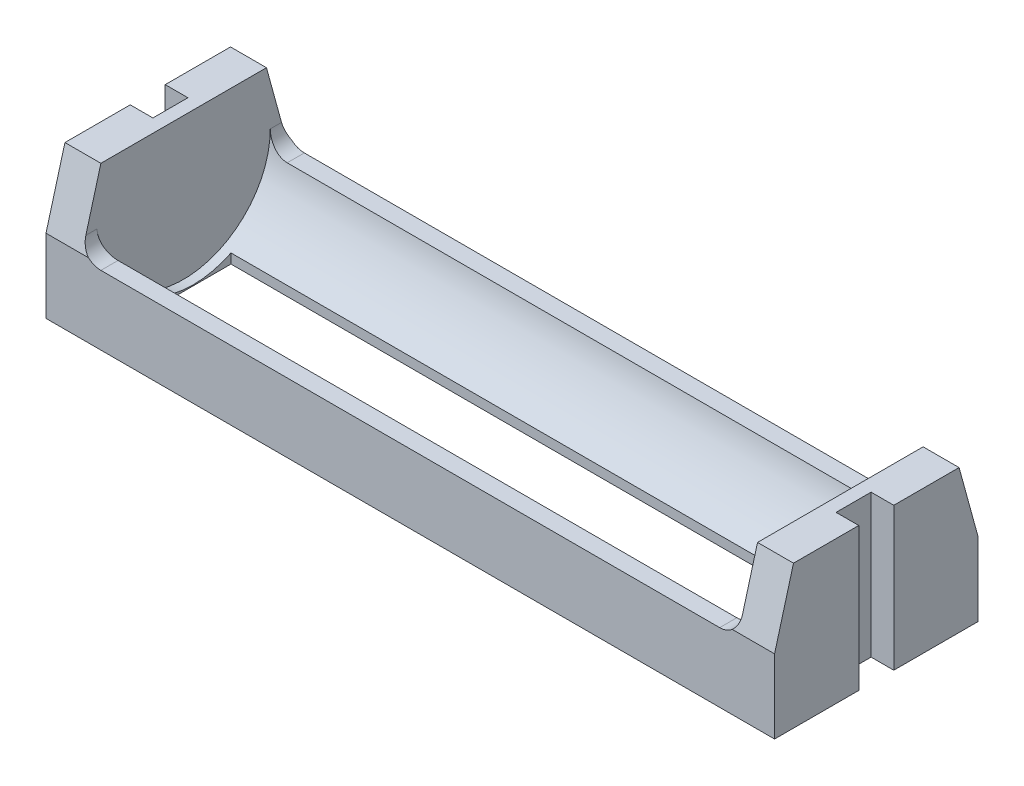
ISO-10303-21;
HEADER;
FILE_DESCRIPTION(('STEP AP214'),'2;1');
FILE_NAME('part.step','',(''),(''),'','','');
FILE_SCHEMA(('AUTOMOTIVE_DESIGN { 1 0 10303 214 1 1 1 1 }'));
ENDSEC;
DATA;
#1=APPLICATION_CONTEXT('core data for automotive mechanical design processes');
#2=APPLICATION_PROTOCOL_DEFINITION('international standard','automotive_design',2000,#1);
#3=PRODUCT_CONTEXT('',#1,'mechanical');
#4=PRODUCT('Part','Part','',(#3));
#5=PRODUCT_RELATED_PRODUCT_CATEGORY('part','',(#4));
#6=PRODUCT_DEFINITION_FORMATION('','',#4);
#7=PRODUCT_DEFINITION_CONTEXT('part definition',#1,'design');
#8=PRODUCT_DEFINITION('design','',#6,#7);
#9=PRODUCT_DEFINITION_SHAPE('','',#8);
#10=(LENGTH_UNIT() NAMED_UNIT(*) SI_UNIT(.MILLI.,.METRE.));
#11=(NAMED_UNIT(*) PLANE_ANGLE_UNIT() SI_UNIT($,.RADIAN.));
#12=(NAMED_UNIT(*) SI_UNIT($,.STERADIAN.) SOLID_ANGLE_UNIT());
#13=UNCERTAINTY_MEASURE_WITH_UNIT(LENGTH_MEASURE(1.E-05),#10,'distance_accuracy_value','');
#14=(GEOMETRIC_REPRESENTATION_CONTEXT(3) GLOBAL_UNCERTAINTY_ASSIGNED_CONTEXT((#13)) GLOBAL_UNIT_ASSIGNED_CONTEXT((#10,
#11,#12)) REPRESENTATION_CONTEXT('',''));
#15=CARTESIAN_POINT('',(0.,0.,0.));
#16=DIRECTION('',(0.,0.,1.));
#17=DIRECTION('',(1.,0.,0.));
#18=AXIS2_PLACEMENT_3D('',#15,#16,#17);
#19=CARTESIAN_POINT('',(38.5,15.1,-10.75));
#20=DIRECTION('',(-1.,0.,0.));
#21=DIRECTION('',(0.,0.,1.));
#22=AXIS2_PLACEMENT_3D('',#19,#20,#21);
#23=PLANE('',#22);
#24=DIRECTION('',(0.,0.,-1.));
#25=VECTOR('',#24,1.);
#26=CARTESIAN_POINT('',(38.5,15.1,-10.75));
#27=LINE('',#26,#25);
#28=CARTESIAN_POINT('',(38.5,15.1,-1.85));
#29=VERTEX_POINT('',#28);
#30=CARTESIAN_POINT('',(38.5,15.1,-8.75));
#31=VERTEX_POINT('',#30);
#32=EDGE_CURVE('E276',#29,#31,#27,.T.);
#33=ORIENTED_EDGE('',*,*,#32,.F.);
#34=DIRECTION('',(0.,-1.,0.));
#35=VECTOR('',#34,1.);
#36=CARTESIAN_POINT('',(38.5,15.1,-1.85));
#37=LINE('',#36,#35);
#38=CARTESIAN_POINT('',(38.5,0.,-1.85));
#39=VERTEX_POINT('',#38);
#40=EDGE_CURVE('E428',#29,#39,#37,.T.);
#41=ORIENTED_EDGE('',*,*,#40,.T.);
#42=DIRECTION('',(0.,0.,-1.));
#43=VECTOR('',#42,1.);
#44=CARTESIAN_POINT('',(38.5,0.,-10.75));
#45=LINE('',#44,#43);
#46=CARTESIAN_POINT('',(38.5,0.,-10.75));
#47=VERTEX_POINT('',#46);
#48=EDGE_CURVE('E269',#39,#47,#45,.T.);
#49=ORIENTED_EDGE('',*,*,#48,.T.);
#50=DIRECTION('',(0.,-1.,0.));
#51=VECTOR('',#50,1.);
#52=CARTESIAN_POINT('',(38.5,15.1,-10.75));
#53=LINE('',#52,#51);
#54=CARTESIAN_POINT('',(38.5,7.79999999999989,-10.75));
#55=VERTEX_POINT('',#54);
#56=EDGE_CURVE('E282',#55,#47,#53,.T.);
#57=ORIENTED_EDGE('',*,*,#56,.F.);
#58=DIRECTION('',(0.,0.964458286836892,0.264235147078597));
#59=VECTOR('',#58,1.);
#60=CARTESIAN_POINT('',(38.5,15.1,-8.75));
#61=LINE('',#60,#59);
#62=EDGE_CURVE('E303',#55,#31,#61,.T.);
#63=ORIENTED_EDGE('',*,*,#62,.T.);
#64=EDGE_LOOP('',(#33,#41,#49,#57,#63));
#65=FACE_BOUND('',#64,.T.);
#66=ADVANCED_FACE('F34',(#65),#23,.F.);
#67=CARTESIAN_POINT('',(-38.5,15.1,-10.75));
#68=DIRECTION('',(1.,0.,0.));
#69=DIRECTION('',(0.,0.,-1.));
#70=AXIS2_PLACEMENT_3D('',#67,#68,#69);
#71=PLANE('',#70);
#72=DIRECTION('',(0.,0.,1.));
#73=VECTOR('',#72,1.);
#74=CARTESIAN_POINT('',(-38.5,15.1,-10.75));
#75=LINE('',#74,#73);
#76=CARTESIAN_POINT('',(-38.5,15.1,1.85));
#77=VERTEX_POINT('',#76);
#78=CARTESIAN_POINT('',(-38.5,15.1,8.74999999999999));
#79=VERTEX_POINT('',#78);
#80=EDGE_CURVE('E257',#77,#79,#75,.T.);
#81=ORIENTED_EDGE('',*,*,#80,.F.);
#82=DIRECTION('',(0.,-1.,0.));
#83=VECTOR('',#82,1.);
#84=CARTESIAN_POINT('',(-38.5,15.1,1.85));
#85=LINE('',#84,#83);
#86=CARTESIAN_POINT('',(-38.5,0.,1.85));
#87=VERTEX_POINT('',#86);
#88=EDGE_CURVE('E450',#77,#87,#85,.T.);
#89=ORIENTED_EDGE('',*,*,#88,.T.);
#90=DIRECTION('',(0.,0.,1.));
#91=VECTOR('',#90,1.);
#92=CARTESIAN_POINT('',(-38.5,0.,-10.75));
#93=LINE('',#92,#91);
#94=CARTESIAN_POINT('',(-38.5,0.,10.75));
#95=VERTEX_POINT('',#94);
#96=EDGE_CURVE('E272',#87,#95,#93,.T.);
#97=ORIENTED_EDGE('',*,*,#96,.T.);
#98=DIRECTION('',(0.,-1.,0.));
#99=VECTOR('',#98,1.);
#100=CARTESIAN_POINT('',(-38.5,15.1,10.75));
#101=LINE('',#100,#99);
#102=CARTESIAN_POINT('',(-38.5,7.79999999999989,10.75));
#103=VERTEX_POINT('',#102);
#104=EDGE_CURVE('E259',#103,#95,#101,.T.);
#105=ORIENTED_EDGE('',*,*,#104,.F.);
#106=DIRECTION('',(0.,0.964458286836892,-0.264235147078597));
#107=VECTOR('',#106,1.);
#108=CARTESIAN_POINT('',(-38.5,15.1,8.74999999999999));
#109=LINE('',#108,#107);
#110=EDGE_CURVE('E292',#103,#79,#109,.T.);
#111=ORIENTED_EDGE('',*,*,#110,.T.);
#112=EDGE_LOOP('',(#81,#89,#97,#105,#111));
#113=FACE_BOUND('',#112,.T.);
#114=ADVANCED_FACE('F529',(#113),#71,.F.);
#115=CARTESIAN_POINT('',(32.7,9.3,-10.75));
#116=DIRECTION('',(0.,0.,1.));
#117=DIRECTION('',(1.,0.,0.));
#118=AXIS2_PLACEMENT_3D('',#115,#116,#117);
#119=CYLINDRICAL_SURFACE('',#118,2.);
#120=DIRECTION('',(0.,0.,1.));
#121=VECTOR('',#120,1.);
#122=CARTESIAN_POINT('',(34.7,9.30000000000001,-10.75));
#123=LINE('',#122,#121);
#124=CARTESIAN_POINT('',(34.7,9.3,9.1498633869583));
#125=VERTEX_POINT('',#124);
#126=CARTESIAN_POINT('',(34.7,9.30000000000001,10.3390410958904));
#127=VERTEX_POINT('',#126);
#128=EDGE_CURVE('E402',#125,#127,#123,.T.);
#129=ORIENTED_EDGE('',*,*,#128,.F.);
#130=CARTESIAN_POINT('',(34.7,9.30000000000001,9.1498633869583));
#131=CARTESIAN_POINT('',(34.7000003814192,9.24447351823052,9.15016960098853));
#132=CARTESIAN_POINT('',(34.6976861265686,9.18897135466801,9.14996402068129));
#133=CARTESIAN_POINT('',(34.6884571981426,9.07837057124859,9.14855696388072));
#134=CARTESIAN_POINT('',(34.6815431073591,9.02327190116368,9.14735561354516));
#135=CARTESIAN_POINT('',(34.6539906528758,8.85937289718779,9.14230799697108));
#136=CARTESIAN_POINT('',(34.6265417559802,8.75168124970104,9.13701943910432));
#137=CARTESIAN_POINT('',(34.5543270732888,8.54255043222191,9.12321393210724));
#138=CARTESIAN_POINT('',(34.5095593199945,8.44111197413789,9.11469661617799));
#139=CARTESIAN_POINT('',(34.40402039627,8.24714599913014,9.09539923460278));
#140=CARTESIAN_POINT('',(34.3432467251979,8.15461987768914,9.08461881544037));
#141=CARTESIAN_POINT('',(34.2064416296697,7.97972287776142,9.06183173700585));
#142=CARTESIAN_POINT('',(34.1302119656655,7.89750906676207,9.04981025952204));
#143=CARTESIAN_POINT('',(33.9650701144002,7.74691070108715,9.026020608089));
#144=CARTESIAN_POINT('',(33.8761552723472,7.67852904850834,9.01425248775795));
#145=CARTESIAN_POINT('',(33.6869191534949,7.55678511399145,8.9921860058458));
#146=CARTESIAN_POINT('',(33.5864769367483,7.50360730710259,8.98190638708622));
#147=CARTESIAN_POINT('',(33.3778550980797,7.41497105012429,8.96421907211148));
#148=CARTESIAN_POINT('',(33.269681189394,7.37949966772341,8.95680928073823));
#149=CARTESIAN_POINT('',(33.0840983756042,7.33570840127058,8.94753150383424));
#150=CARTESIAN_POINT('',(33.0078943128663,7.32233549726263,8.94464947676646));
#151=CARTESIAN_POINT('',(32.8544728958222,7.30447730036716,8.94077534351244));
#152=CARTESIAN_POINT('',(32.7772564807583,7.299984285381,8.93978159527668));
#153=CARTESIAN_POINT('',(32.7,7.3,8.9397986554508));
#154=B_SPLINE_CURVE_WITH_KNOTS('',3,(#130,#131,#132,#133,#134,#135,#136,#137,#138,#139,#140,
#141,#142,#143,#144,#145,#146,#147,#148,#149,#150,#151,#152,#153),.UNSPECIFIED.,.F.,.F.,(4,2,2,
2,2,2,2,2,2,2,2,4),(0.,0.166477876175081,0.332934663879728,0.664994473462219,0.997092017584948,
1.32924147689143,1.66595641351316,2.00274192249642,2.34345541106594,2.68391968593159,
2.91567808396264,3.14723485221533),.UNSPECIFIED.);
#155=CARTESIAN_POINT('',(32.7,7.3,8.9397986554508));
#156=VERTEX_POINT('',#155);
#157=EDGE_CURVE('E370',#125,#156,#154,.T.);
#158=ORIENTED_EDGE('',*,*,#157,.T.);
#159=DIRECTION('',(0.,0.,1.));
#160=VECTOR('',#159,1.);
#161=CARTESIAN_POINT('',(32.7,7.3,-10.75));
#162=LINE('',#161,#160);
#163=CARTESIAN_POINT('',(32.7,7.3,10.75));
#164=VERTEX_POINT('',#163);
#165=EDGE_CURVE('E406',#156,#164,#162,.T.);
#166=ORIENTED_EDGE('',*,*,#165,.T.);
#167=CARTESIAN_POINT('',(32.7,9.3,10.75));
#168=DIRECTION('',(0.,0.,1.));
#169=DIRECTION('',(1.,0.,0.));
#170=AXIS2_PLACEMENT_3D('',#167,#168,#169);
#171=CIRCLE('',#170,2.);
#172=CARTESIAN_POINT('',(34.0228756555322,7.79999999999989,10.75));
#173=VERTEX_POINT('',#172);
#174=EDGE_CURVE('E381',#164,#173,#171,.T.);
#175=ORIENTED_EDGE('',*,*,#174,.T.);
#176=CARTESIAN_POINT('',(32.7,9.3,10.3390410958904));
#177=DIRECTION('',(0.,0.264235147078597,0.964458286836892));
#178=DIRECTION('',(0.,-0.964458286836892,0.264235147078597));
#179=AXIS2_PLACEMENT_3D('',#176,#177,#178);
#180=ELLIPSE('',#179,2.07370295563466,2.);
#181=EDGE_CURVE('E315',#173,#127,#180,.T.);
#182=ORIENTED_EDGE('',*,*,#181,.T.);
#183=EDGE_LOOP('',(#129,#158,#166,#175,#182));
#184=FACE_BOUND('',#183,.T.);
#185=ADVANCED_FACE('F368',(#184),#119,.F.);
#186=CARTESIAN_POINT('',(-32.7,7.3,-10.75));
#187=DIRECTION('',(0.,-1.,0.));
#188=DIRECTION('',(0.,0.,-1.));
#189=AXIS2_PLACEMENT_3D('',#186,#187,#188);
#190=PLANE('',#189);
#191=DIRECTION('',(0.,0.,1.));
#192=VECTOR('',#191,1.);
#193=CARTESIAN_POINT('',(-32.7,7.3,-10.75));
#194=LINE('',#193,#192);
#195=CARTESIAN_POINT('',(-32.7,7.3,-10.75));
#196=VERTEX_POINT('',#195);
#197=CARTESIAN_POINT('',(-32.7,7.3,-8.9397986554508));
#198=VERTEX_POINT('',#197);
#199=EDGE_CURVE('E407',#196,#198,#194,.T.);
#200=ORIENTED_EDGE('',*,*,#199,.T.);
#201=DIRECTION('',(1.,0.,0.));
#202=VECTOR('',#201,1.);
#203=CARTESIAN_POINT('',(-60.5801081914276,7.3,-8.9397986554508));
#204=LINE('',#203,#202);
#205=CARTESIAN_POINT('',(32.7,7.3,-8.9397986554508));
#206=VERTEX_POINT('',#205);
#207=EDGE_CURVE('E361',#198,#206,#204,.T.);
#208=ORIENTED_EDGE('',*,*,#207,.T.);
#209=CARTESIAN_POINT('',(32.7,7.3,-10.75));
#210=VERTEX_POINT('',#209);
#211=EDGE_CURVE('E403',#210,#206,#162,.T.);
#212=ORIENTED_EDGE('',*,*,#211,.F.);
#213=DIRECTION('',(1.,0.,0.));
#214=VECTOR('',#213,1.);
#215=CARTESIAN_POINT('',(-32.7,7.3,-10.75));
#216=LINE('',#215,#214);
#217=EDGE_CURVE('E380',#196,#210,#216,.T.);
#218=ORIENTED_EDGE('',*,*,#217,.F.);
#219=EDGE_LOOP('',(#200,#208,#212,#218));
#220=FACE_BOUND('',#219,.T.);
#221=ADVANCED_FACE('F502',(#220),#190,.F.);
#222=CARTESIAN_POINT('',(-32.7,9.3,-10.75));
#223=DIRECTION('',(0.,0.,1.));
#224=DIRECTION('',(1.,0.,0.));
#225=AXIS2_PLACEMENT_3D('',#222,#223,#224);
#226=CYLINDRICAL_SURFACE('',#225,2.);
#227=CARTESIAN_POINT('',(-32.7,7.3,8.9397986554508));
#228=VERTEX_POINT('',#227);
#229=CARTESIAN_POINT('',(-32.7,7.3,10.75));
#230=VERTEX_POINT('',#229);
#231=EDGE_CURVE('E410',#228,#230,#194,.T.);
#232=ORIENTED_EDGE('',*,*,#231,.F.);
#233=CARTESIAN_POINT('',(-32.7,7.3,8.9397986554508));
#234=CARTESIAN_POINT('',(-32.7555927508141,7.29999961020679,8.93979549930712));
#235=CARTESIAN_POINT('',(-32.8111582140747,7.30231938618891,8.94030490376732));
#236=CARTESIAN_POINT('',(-32.9218785323546,7.31156890879201,8.94231615197878));
#237=CARTESIAN_POINT('',(-32.9770334419478,7.31849803122341,8.94381786135367));
#238=CARTESIAN_POINT('',(-33.1410880254544,7.34610720259547,8.9497524117272));
#239=CARTESIAN_POINT('',(-33.2488683556103,7.37360942513651,8.95561500839226));
#240=CARTESIAN_POINT('',(-33.4581482770812,7.44595309688481,8.97046599019638));
#241=CARTESIAN_POINT('',(-33.559647398922,7.49079584035754,8.97945460865109));
#242=CARTESIAN_POINT('',(-33.7537229248556,7.59651089056488,8.99951990736819));
#243=CARTESIAN_POINT('',(-33.8462977587527,7.65738601113137,9.01059695407219));
#244=CARTESIAN_POINT('',(-34.0213292454586,7.79446857612004,9.03375978541136));
#245=CARTESIAN_POINT('',(-34.1036222461514,7.87088285795433,9.04585773156088));
#246=CARTESIAN_POINT('',(-34.2543356298042,8.03644463992197,9.06955143579611));
#247=CARTESIAN_POINT('',(-34.3227534791614,8.12559446050856,9.08114710186203));
#248=CARTESIAN_POINT('',(-34.4443857539703,8.31515228640953,9.1026224935208));
#249=CARTESIAN_POINT('',(-34.49744642179,8.41566101979673,9.11248450142029));
#250=CARTESIAN_POINT('',(-34.5858369922622,8.6243956096749,9.12918662394288));
#251=CARTESIAN_POINT('',(-34.6211796923849,8.73261583153579,9.13602891923855));
#252=CARTESIAN_POINT('',(-34.6646602825389,8.91786920163539,9.14427713384794));
#253=CARTESIAN_POINT('',(-34.6778965455126,8.99369860599084,9.14672480156106));
#254=CARTESIAN_POINT('',(-34.6955700464009,9.1463413698306,9.14973465559631));
#255=CARTESIAN_POINT('',(-34.7000153337956,9.22315376429997,9.15029856711127));
#256=CARTESIAN_POINT('',(-34.7,9.3,9.1498633869583));
#257=B_SPLINE_CURVE_WITH_KNOTS('',3,(#233,#234,#235,#236,#237,#238,#239,#240,#241,#242,#243,
#244,#245,#246,#247,#248,#249,#250,#251,#252,#253,#254,#255,#256),.UNSPECIFIED.,.F.,.F.,(4,2,2,
2,2,2,2,2,2,2,2,4),(0.,0.166673718115008,0.333324870162048,0.665766080619783,0.99823210868575,
1.33075652657495,1.66803686410081,2.00537873367856,2.34598969669459,2.6863542848618,
2.91689846852728,3.14723145587301),.UNSPECIFIED.);
#258=CARTESIAN_POINT('',(-34.7,9.3,9.1498633869583));
#259=VERTEX_POINT('',#258);
#260=EDGE_CURVE('E329',#228,#259,#257,.T.);
#261=ORIENTED_EDGE('',*,*,#260,.T.);
#262=DIRECTION('',(0.,0.,1.));
#263=VECTOR('',#262,1.);
#264=CARTESIAN_POINT('',(-34.7,9.3,-10.75));
#265=LINE('',#264,#263);
#266=CARTESIAN_POINT('',(-34.7,9.3,10.3390410958904));
#267=VERTEX_POINT('',#266);
#268=EDGE_CURVE('E387',#259,#267,#265,.T.);
#269=ORIENTED_EDGE('',*,*,#268,.T.);
#270=CARTESIAN_POINT('',(-32.7,9.3,10.3390410958904));
#271=DIRECTION('',(0.,0.264235147078597,0.964458286836892));
#272=DIRECTION('',(0.,-0.964458286836892,0.264235147078597));
#273=AXIS2_PLACEMENT_3D('',#270,#271,#272);
#274=ELLIPSE('',#273,2.07370295563466,2.);
#275=CARTESIAN_POINT('',(-34.0228756555322,7.79999999999989,10.75));
#276=VERTEX_POINT('',#275);
#277=EDGE_CURVE('E310',#267,#276,#274,.T.);
#278=ORIENTED_EDGE('',*,*,#277,.T.);
#279=CARTESIAN_POINT('',(-32.7,9.3,10.75));
#280=DIRECTION('',(0.,0.,1.));
#281=DIRECTION('',(-1.,0.,0.));
#282=AXIS2_PLACEMENT_3D('',#279,#280,#281);
#283=CIRCLE('',#282,2.);
#284=EDGE_CURVE('E376',#276,#230,#283,.T.);
#285=ORIENTED_EDGE('',*,*,#284,.T.);
#286=EDGE_LOOP('',(#232,#261,#269,#278,#285));
#287=FACE_BOUND('',#286,.T.);
#288=ADVANCED_FACE('F740',(#287),#226,.F.);
#289=CARTESIAN_POINT('',(0.,15.1,0.));
#290=DIRECTION('',(0.,1.,0.));
#291=DIRECTION('',(0.,0.,1.));
#292=AXIS2_PLACEMENT_3D('',#289,#290,#291);
#293=PLANE('',#292);
#294=DIRECTION('',(-1.,0.,0.));
#295=VECTOR('',#294,1.);
#296=CARTESIAN_POINT('',(-38.5,15.1,1.85));
#297=LINE('',#296,#295);
#298=CARTESIAN_POINT('',(-36.1,15.1,1.85));
#299=VERTEX_POINT('',#298);
#300=EDGE_CURVE('E248',#299,#77,#297,.T.);
#301=ORIENTED_EDGE('',*,*,#300,.T.);
#302=ORIENTED_EDGE('',*,*,#80,.T.);
#303=DIRECTION('',(1.,0.,0.));
#304=VECTOR('',#303,1.);
#305=CARTESIAN_POINT('',(38.5,15.1,8.74999999999999));
#306=LINE('',#305,#304);
#307=CARTESIAN_POINT('',(-34.7,15.1,8.74999999999999));
#308=VERTEX_POINT('',#307);
#309=EDGE_CURVE('E286',#79,#308,#306,.T.);
#310=ORIENTED_EDGE('',*,*,#309,.T.);
#311=DIRECTION('',(0.,0.,1.));
#312=VECTOR('',#311,1.);
#313=CARTESIAN_POINT('',(-34.7,15.1,-10.75));
#314=LINE('',#313,#312);
#315=CARTESIAN_POINT('',(-34.7,15.1,-8.75));
#316=VERTEX_POINT('',#315);
#317=EDGE_CURVE('E394',#316,#308,#314,.T.);
#318=ORIENTED_EDGE('',*,*,#317,.F.);
#319=DIRECTION('',(-1.,0.,0.));
#320=VECTOR('',#319,1.);
#321=CARTESIAN_POINT('',(-38.5,15.1,-8.75));
#322=LINE('',#321,#320);
#323=CARTESIAN_POINT('',(-38.5,15.1,-8.75));
#324=VERTEX_POINT('',#323);
#325=EDGE_CURVE('E254',#316,#324,#322,.T.);
#326=ORIENTED_EDGE('',*,*,#325,.T.);
#327=CARTESIAN_POINT('',(-38.5,15.1,-1.85));
#328=VERTEX_POINT('',#327);
#329=EDGE_CURVE('E245',#324,#328,#75,.T.);
#330=ORIENTED_EDGE('',*,*,#329,.T.);
#331=DIRECTION('',(1.,0.,0.));
#332=VECTOR('',#331,1.);
#333=CARTESIAN_POINT('',(-38.5,15.1,-1.85));
#334=LINE('',#333,#332);
#335=CARTESIAN_POINT('',(-36.1,15.1,-1.85));
#336=VERTEX_POINT('',#335);
#337=EDGE_CURVE('E231',#328,#336,#334,.T.);
#338=ORIENTED_EDGE('',*,*,#337,.T.);
#339=DIRECTION('',(0.,0.,1.));
#340=VECTOR('',#339,1.);
#341=CARTESIAN_POINT('',(-36.1,15.1,1.85));
#342=LINE('',#341,#340);
#343=EDGE_CURVE('E238',#336,#299,#342,.T.);
#344=ORIENTED_EDGE('',*,*,#343,.T.);
#345=EDGE_LOOP('',(#301,#302,#310,#318,#326,#330,#338,#344));
#346=FACE_BOUND('',#345,.T.);
#347=ADVANCED_FACE('F251',(#346),#293,.T.);
#348=CARTESIAN_POINT('',(0.,15.1,-8.75));
#349=DIRECTION('',(0.,0.264235147078597,-0.964458286836892));
#350=DIRECTION('',(1.,0.,0.));
#351=AXIS2_PLACEMENT_3D('',#348,#349,#350);
#352=PLANE('',#351);
#353=DIRECTION('',(0.,-0.964458286836892,-0.264235147078597));
#354=VECTOR('',#353,1.);
#355=CARTESIAN_POINT('',(34.7,15.1,-8.75));
#356=LINE('',#355,#354);
#357=CARTESIAN_POINT('',(34.7,15.1,-8.75));
#358=VERTEX_POINT('',#357);
#359=CARTESIAN_POINT('',(34.7,9.30000000000001,-10.3390410958904));
#360=VERTEX_POINT('',#359);
#361=EDGE_CURVE('E417',#358,#360,#356,.T.);
#362=ORIENTED_EDGE('',*,*,#361,.F.);
#363=EDGE_CURVE('E289',#31,#358,#322,.T.);
#364=ORIENTED_EDGE('',*,*,#363,.F.);
#365=ORIENTED_EDGE('',*,*,#62,.F.);
#366=DIRECTION('',(1.,0.,0.));
#367=VECTOR('',#366,1.);
#368=CARTESIAN_POINT('',(38.5,7.79999999999989,-10.75));
#369=LINE('',#368,#367);
#370=CARTESIAN_POINT('',(34.0228756555322,7.79999999999989,-10.75));
#371=VERTEX_POINT('',#370);
#372=EDGE_CURVE('E297',#371,#55,#369,.T.);
#373=ORIENTED_EDGE('',*,*,#372,.F.);
#374=CARTESIAN_POINT('',(32.7,9.3,-10.3390410958904));
#375=DIRECTION('',(0.,0.264235147078597,-0.964458286836892));
#376=DIRECTION('',(0.,0.964458286836892,0.264235147078597));
#377=AXIS2_PLACEMENT_3D('',#374,#375,#376);
#378=ELLIPSE('',#377,2.07370295563466,2.);
#379=EDGE_CURVE('E415',#360,#371,#378,.T.);
#380=ORIENTED_EDGE('',*,*,#379,.F.);
#381=EDGE_LOOP('',(#362,#364,#365,#373,#380));
#382=FACE_BOUND('',#381,.T.);
#383=ADVANCED_FACE('F514',(#382),#352,.T.);
#384=CARTESIAN_POINT('',(0.,15.1,8.74999999999999));
#385=DIRECTION('',(0.,0.264235147078597,0.964458286836892));
#386=DIRECTION('',(-1.,0.,0.));
#387=AXIS2_PLACEMENT_3D('',#384,#385,#386);
#388=PLANE('',#387);
#389=DIRECTION('',(0.,0.964458286836892,-0.264235147078597));
#390=VECTOR('',#389,1.);
#391=CARTESIAN_POINT('',(34.7,15.1,8.74999999999999));
#392=LINE('',#391,#390);
#393=CARTESIAN_POINT('',(34.7,15.1,8.74999999999999));
#394=VERTEX_POINT('',#393);
#395=EDGE_CURVE('E318',#127,#394,#392,.T.);
#396=ORIENTED_EDGE('',*,*,#395,.F.);
#397=ORIENTED_EDGE('',*,*,#181,.F.);
#398=DIRECTION('',(-1.,0.,0.));
#399=VECTOR('',#398,1.);
#400=CARTESIAN_POINT('',(-38.5,7.79999999999989,10.75));
#401=LINE('',#400,#399);
#402=CARTESIAN_POINT('',(38.5,7.79999999999989,10.75));
#403=VERTEX_POINT('',#402);
#404=EDGE_CURVE('E307',#403,#173,#401,.T.);
#405=ORIENTED_EDGE('',*,*,#404,.F.);
#406=DIRECTION('',(0.,-0.964458286836892,0.264235147078597));
#407=VECTOR('',#406,1.);
#408=CARTESIAN_POINT('',(38.5,15.1,8.74999999999999));
#409=LINE('',#408,#407);
#410=CARTESIAN_POINT('',(38.5,15.1,8.74999999999999));
#411=VERTEX_POINT('',#410);
#412=EDGE_CURVE('E301',#411,#403,#409,.T.);
#413=ORIENTED_EDGE('',*,*,#412,.F.);
#414=EDGE_CURVE('E285',#394,#411,#306,.T.);
#415=ORIENTED_EDGE('',*,*,#414,.F.);
#416=EDGE_LOOP('',(#396,#397,#405,#413,#415));
#417=FACE_BOUND('',#416,.T.);
#418=ADVANCED_FACE('F521',(#417),#388,.T.);
#419=CARTESIAN_POINT('',(38.5,0.,10.75));
#420=VERTEX_POINT('',#419);
#421=CARTESIAN_POINT('',(38.5,0.,1.85));
#422=VERTEX_POINT('',#421);
#423=EDGE_CURVE('E265',#420,#422,#45,.T.);
#424=ORIENTED_EDGE('',*,*,#423,.T.);
#425=DIRECTION('',(0.,-1.,0.));
#426=VECTOR('',#425,1.);
#427=CARTESIAN_POINT('',(38.5,15.1,1.85));
#428=LINE('',#427,#426);
#429=CARTESIAN_POINT('',(38.5,15.1,1.85));
#430=VERTEX_POINT('',#429);
#431=EDGE_CURVE('E466',#430,#422,#428,.T.);
#432=ORIENTED_EDGE('',*,*,#431,.F.);
#433=EDGE_CURVE('E261',#411,#430,#27,.T.);
#434=ORIENTED_EDGE('',*,*,#433,.F.);
#435=ORIENTED_EDGE('',*,*,#412,.T.);
#436=DIRECTION('',(0.,-1.,0.));
#437=VECTOR('',#436,1.);
#438=CARTESIAN_POINT('',(38.5,15.1,10.75));
#439=LINE('',#438,#437);
#440=EDGE_CURVE('E256',#403,#420,#439,.T.);
#441=ORIENTED_EDGE('',*,*,#440,.T.);
#442=EDGE_LOOP('',(#424,#432,#434,#435,#441));
#443=FACE_BOUND('',#442,.T.);
#444=ADVANCED_FACE('F530',(#443),#23,.F.);
#445=CARTESIAN_POINT('',(-38.5,15.1,-10.75));
#446=DIRECTION('',(0.,0.,1.));
#447=DIRECTION('',(1.,0.,0.));
#448=AXIS2_PLACEMENT_3D('',#445,#446,#447);
#449=PLANE('',#448);
#450=ORIENTED_EDGE('',*,*,#217,.T.);
#451=CARTESIAN_POINT('',(32.7,9.3,-10.75));
#452=DIRECTION('',(0.,0.,1.));
#453=DIRECTION('',(1.,0.,0.));
#454=AXIS2_PLACEMENT_3D('',#451,#452,#453);
#455=CIRCLE('',#454,2.);
#456=EDGE_CURVE('E384',#210,#371,#455,.T.);
#457=ORIENTED_EDGE('',*,*,#456,.T.);
#458=ORIENTED_EDGE('',*,*,#372,.T.);
#459=ORIENTED_EDGE('',*,*,#56,.T.);
#460=DIRECTION('',(-1.,0.,0.));
#461=VECTOR('',#460,1.);
#462=CARTESIAN_POINT('',(-38.5,0.,-10.75));
#463=LINE('',#462,#461);
#464=CARTESIAN_POINT('',(-38.5,0.,-10.75));
#465=VERTEX_POINT('',#464);
#466=EDGE_CURVE('E268',#47,#465,#463,.T.);
#467=ORIENTED_EDGE('',*,*,#466,.T.);
#468=DIRECTION('',(0.,-1.,0.));
#469=VECTOR('',#468,1.);
#470=CARTESIAN_POINT('',(-38.5,15.1,-10.75));
#471=LINE('',#470,#469);
#472=CARTESIAN_POINT('',(-38.5,7.79999999999989,-10.75));
#473=VERTEX_POINT('',#472);
#474=EDGE_CURVE('E280',#473,#465,#471,.T.);
#475=ORIENTED_EDGE('',*,*,#474,.F.);
#476=CARTESIAN_POINT('',(-34.0228756555322,7.79999999999989,-10.75));
#477=VERTEX_POINT('',#476);
#478=EDGE_CURVE('E298',#473,#477,#369,.T.);
#479=ORIENTED_EDGE('',*,*,#478,.T.);
#480=CARTESIAN_POINT('',(-32.7,9.3,-10.75));
#481=DIRECTION('',(0.,0.,1.));
#482=DIRECTION('',(-1.,0.,0.));
#483=AXIS2_PLACEMENT_3D('',#480,#481,#482);
#484=CIRCLE('',#483,2.);
#485=EDGE_CURVE('E377',#477,#196,#484,.T.);
#486=ORIENTED_EDGE('',*,*,#485,.T.);
#487=EDGE_LOOP('',(#450,#457,#458,#459,#467,#475,#479,#486));
#488=FACE_BOUND('',#487,.T.);
#489=ADVANCED_FACE('F433',(#488),#449,.F.);
#490=CARTESIAN_POINT('',(-38.5,0.,-1.85));
#491=VERTEX_POINT('',#490);
#492=EDGE_CURVE('E247',#465,#491,#93,.T.);
#493=ORIENTED_EDGE('',*,*,#492,.T.);
#494=DIRECTION('',(0.,-1.,0.));
#495=VECTOR('',#494,1.);
#496=CARTESIAN_POINT('',(-38.5,15.1,-1.85));
#497=LINE('',#496,#495);
#498=EDGE_CURVE('E57',#328,#491,#497,.T.);
#499=ORIENTED_EDGE('',*,*,#498,.F.);
#500=ORIENTED_EDGE('',*,*,#329,.F.);
#501=DIRECTION('',(0.,-0.964458286836892,-0.264235147078597));
#502=VECTOR('',#501,1.);
#503=CARTESIAN_POINT('',(-38.5,15.1,-8.75));
#504=LINE('',#503,#502);
#505=EDGE_CURVE('E295',#324,#473,#504,.T.);
#506=ORIENTED_EDGE('',*,*,#505,.T.);
#507=ORIENTED_EDGE('',*,*,#474,.T.);
#508=EDGE_LOOP('',(#493,#499,#500,#506,#507));
#509=FACE_BOUND('',#508,.T.);
#510=ADVANCED_FACE('F244',(#509),#71,.F.);
#511=CARTESIAN_POINT('',(-38.5,15.1,10.75));
#512=DIRECTION('',(0.,0.,-1.));
#513=DIRECTION('',(-1.,0.,0.));
#514=AXIS2_PLACEMENT_3D('',#511,#512,#513);
#515=PLANE('',#514);
#516=ORIENTED_EDGE('',*,*,#404,.T.);
#517=ORIENTED_EDGE('',*,*,#174,.F.);
#518=DIRECTION('',(1.,0.,0.));
#519=VECTOR('',#518,1.);
#520=CARTESIAN_POINT('',(-32.7,7.3,10.75));
#521=LINE('',#520,#519);
#522=EDGE_CURVE('E390',#230,#164,#521,.T.);
#523=ORIENTED_EDGE('',*,*,#522,.F.);
#524=ORIENTED_EDGE('',*,*,#284,.F.);
#525=EDGE_CURVE('E306',#276,#103,#401,.T.);
#526=ORIENTED_EDGE('',*,*,#525,.T.);
#527=ORIENTED_EDGE('',*,*,#104,.T.);
#528=DIRECTION('',(1.,0.,0.));
#529=VECTOR('',#528,1.);
#530=CARTESIAN_POINT('',(-38.5,0.,10.75));
#531=LINE('',#530,#529);
#532=EDGE_CURVE('E274',#95,#420,#531,.T.);
#533=ORIENTED_EDGE('',*,*,#532,.T.);
#534=ORIENTED_EDGE('',*,*,#440,.F.);
#535=EDGE_LOOP('',(#516,#517,#523,#524,#526,#527,#533,#534));
#536=FACE_BOUND('',#535,.T.);
#537=ADVANCED_FACE('F569',(#536),#515,.F.);
#538=DIRECTION('',(1.,0.,0.));
#539=VECTOR('',#538,1.);
#540=CARTESIAN_POINT('',(38.5,15.1,-1.85));
#541=LINE('',#540,#539);
#542=CARTESIAN_POINT('',(36.1,15.1,-1.85));
#543=VERTEX_POINT('',#542);
#544=EDGE_CURVE('E463',#543,#29,#541,.T.);
#545=ORIENTED_EDGE('',*,*,#544,.T.);
#546=ORIENTED_EDGE('',*,*,#32,.T.);
#547=ORIENTED_EDGE('',*,*,#363,.T.);
#548=DIRECTION('',(0.,0.,1.));
#549=VECTOR('',#548,1.);
#550=CARTESIAN_POINT('',(34.7,15.1,-10.75));
#551=LINE('',#550,#549);
#552=EDGE_CURVE('E397',#358,#394,#551,.T.);
#553=ORIENTED_EDGE('',*,*,#552,.T.);
#554=ORIENTED_EDGE('',*,*,#414,.T.);
#555=ORIENTED_EDGE('',*,*,#433,.T.);
#556=DIRECTION('',(-1.,0.,0.));
#557=VECTOR('',#556,1.);
#558=CARTESIAN_POINT('',(38.5,15.1,1.85));
#559=LINE('',#558,#557);
#560=CARTESIAN_POINT('',(36.1,15.1,1.85));
#561=VERTEX_POINT('',#560);
#562=EDGE_CURVE('E456',#430,#561,#559,.T.);
#563=ORIENTED_EDGE('',*,*,#562,.T.);
#564=DIRECTION('',(0.,0.,-1.));
#565=VECTOR('',#564,1.);
#566=CARTESIAN_POINT('',(36.1,15.1,1.85));
#567=LINE('',#566,#565);
#568=EDGE_CURVE('E459',#561,#543,#567,.T.);
#569=ORIENTED_EDGE('',*,*,#568,.T.);
#570=EDGE_LOOP('',(#545,#546,#547,#553,#554,#555,#563,#569));
#571=FACE_BOUND('',#570,.T.);
#572=ADVANCED_FACE('F522',(#571),#293,.T.);
#573=CARTESIAN_POINT('',(0.,0.,0.));
#574=DIRECTION('',(0.,1.,0.));
#575=DIRECTION('',(0.,0.,1.));
#576=AXIS2_PLACEMENT_3D('',#573,#574,#575);
#577=PLANE('',#576);
#578=DIRECTION('',(-1.,0.,0.));
#579=VECTOR('',#578,1.);
#580=CARTESIAN_POINT('',(-33.7,0.,4.));
#581=LINE('',#580,#579);
#582=CARTESIAN_POINT('',(33.7,0.,4.));
#583=VERTEX_POINT('',#582);
#584=CARTESIAN_POINT('',(-33.7,0.,4.));
#585=VERTEX_POINT('',#584);
#586=EDGE_CURVE('E479',#583,#585,#581,.T.);
#587=ORIENTED_EDGE('',*,*,#586,.F.);
#588=DIRECTION('',(0.,0.,1.));
#589=VECTOR('',#588,1.);
#590=CARTESIAN_POINT('',(33.7,0.,4.));
#591=LINE('',#590,#589);
#592=CARTESIAN_POINT('',(33.7,0.,-4.));
#593=VERTEX_POINT('',#592);
#594=EDGE_CURVE('E49',#593,#583,#591,.T.);
#595=ORIENTED_EDGE('',*,*,#594,.F.);
#596=DIRECTION('',(1.,0.,0.));
#597=VECTOR('',#596,1.);
#598=CARTESIAN_POINT('',(-33.7,0.,-4.));
#599=LINE('',#598,#597);
#600=CARTESIAN_POINT('',(-33.7,0.,-4.));
#601=VERTEX_POINT('',#600);
#602=EDGE_CURVE('E485',#601,#593,#599,.T.);
#603=ORIENTED_EDGE('',*,*,#602,.F.);
#604=DIRECTION('',(0.,0.,-1.));
#605=VECTOR('',#604,1.);
#606=CARTESIAN_POINT('',(-33.7,0.,4.));
#607=LINE('',#606,#605);
#608=EDGE_CURVE('E482',#585,#601,#607,.T.);
#609=ORIENTED_EDGE('',*,*,#608,.F.);
#610=EDGE_LOOP('',(#587,#595,#603,#609));
#611=FACE_BOUND('',#610,.T.);
#612=ORIENTED_EDGE('',*,*,#48,.F.);
#613=DIRECTION('',(1.,0.,0.));
#614=VECTOR('',#613,1.);
#615=CARTESIAN_POINT('',(38.5,0.,-1.85));
#616=LINE('',#615,#614);
#617=CARTESIAN_POINT('',(36.1,0.,-1.85));
#618=VERTEX_POINT('',#617);
#619=EDGE_CURVE('E460',#618,#39,#616,.T.);
#620=ORIENTED_EDGE('',*,*,#619,.F.);
#621=DIRECTION('',(0.,0.,-1.));
#622=VECTOR('',#621,1.);
#623=CARTESIAN_POINT('',(36.1,0.,1.85));
#624=LINE('',#623,#622);
#625=CARTESIAN_POINT('',(36.1,0.,1.85));
#626=VERTEX_POINT('',#625);
#627=EDGE_CURVE('E470',#626,#618,#624,.T.);
#628=ORIENTED_EDGE('',*,*,#627,.F.);
#629=DIRECTION('',(-1.,0.,0.));
#630=VECTOR('',#629,1.);
#631=CARTESIAN_POINT('',(38.5,0.,1.85));
#632=LINE('',#631,#630);
#633=EDGE_CURVE('E467',#422,#626,#632,.T.);
#634=ORIENTED_EDGE('',*,*,#633,.F.);
#635=ORIENTED_EDGE('',*,*,#423,.F.);
#636=ORIENTED_EDGE('',*,*,#532,.F.);
#637=ORIENTED_EDGE('',*,*,#96,.F.);
#638=DIRECTION('',(-1.,0.,0.));
#639=VECTOR('',#638,1.);
#640=CARTESIAN_POINT('',(-38.5,0.,1.85));
#641=LINE('',#640,#639);
#642=CARTESIAN_POINT('',(-36.1,0.,1.85));
#643=VERTEX_POINT('',#642);
#644=EDGE_CURVE('E239',#643,#87,#641,.T.);
#645=ORIENTED_EDGE('',*,*,#644,.F.);
#646=DIRECTION('',(0.,0.,1.));
#647=VECTOR('',#646,1.);
#648=CARTESIAN_POINT('',(-36.1,0.,1.85));
#649=LINE('',#648,#647);
#650=CARTESIAN_POINT('',(-36.1,0.,-1.85));
#651=VERTEX_POINT('',#650);
#652=EDGE_CURVE('E441',#651,#643,#649,.T.);
#653=ORIENTED_EDGE('',*,*,#652,.F.);
#654=DIRECTION('',(1.,0.,0.));
#655=VECTOR('',#654,1.);
#656=CARTESIAN_POINT('',(-38.5,0.,-1.85));
#657=LINE('',#656,#655);
#658=EDGE_CURVE('E438',#491,#651,#657,.T.);
#659=ORIENTED_EDGE('',*,*,#658,.F.);
#660=ORIENTED_EDGE('',*,*,#492,.F.);
#661=ORIENTED_EDGE('',*,*,#466,.F.);
#662=EDGE_LOOP('',(#612,#620,#628,#634,#635,#636,#637,#645,#653,#659,#660,#661));
#663=FACE_BOUND('',#662,.T.);
#664=ADVANCED_FACE('F436',(#611,#663),#577,.F.);
#665=DIRECTION('',(0.,0.964458286836892,0.264235147078597));
#666=VECTOR('',#665,1.);
#667=CARTESIAN_POINT('',(-34.7,15.1,-8.75));
#668=LINE('',#667,#666);
#669=CARTESIAN_POINT('',(-34.7,9.3,-10.3390410958904));
#670=VERTEX_POINT('',#669);
#671=EDGE_CURVE('E418',#670,#316,#668,.T.);
#672=ORIENTED_EDGE('',*,*,#671,.F.);
#673=CARTESIAN_POINT('',(-32.7,9.3,-10.3390410958904));
#674=DIRECTION('',(0.,0.264235147078597,-0.964458286836892));
#675=DIRECTION('',(0.,0.964458286836892,0.264235147078597));
#676=AXIS2_PLACEMENT_3D('',#673,#674,#675);
#677=ELLIPSE('',#676,2.07370295563466,2.);
#678=EDGE_CURVE('E396',#477,#670,#677,.T.);
#679=ORIENTED_EDGE('',*,*,#678,.F.);
#680=ORIENTED_EDGE('',*,*,#478,.F.);
#681=ORIENTED_EDGE('',*,*,#505,.F.);
#682=ORIENTED_EDGE('',*,*,#325,.F.);
#683=EDGE_LOOP('',(#672,#679,#680,#681,#682));
#684=FACE_BOUND('',#683,.T.);
#685=ADVANCED_FACE('F512',(#684),#352,.T.);
#686=DIRECTION('',(0.,-0.964458286836892,0.264235147078597));
#687=VECTOR('',#686,1.);
#688=CARTESIAN_POINT('',(-34.7,15.1,8.74999999999999));
#689=LINE('',#688,#687);
#690=EDGE_CURVE('E312',#308,#267,#689,.T.);
#691=ORIENTED_EDGE('',*,*,#690,.F.);
#692=ORIENTED_EDGE('',*,*,#309,.F.);
#693=ORIENTED_EDGE('',*,*,#110,.F.);
#694=ORIENTED_EDGE('',*,*,#525,.F.);
#695=ORIENTED_EDGE('',*,*,#277,.F.);
#696=EDGE_LOOP('',(#691,#692,#693,#694,#695));
#697=FACE_BOUND('',#696,.T.);
#698=ADVANCED_FACE('F36',(#697),#388,.T.);
#699=CARTESIAN_POINT('',(-34.7,15.1,-10.75));
#700=DIRECTION('',(-1.,0.,0.));
#701=DIRECTION('',(0.,0.,1.));
#702=AXIS2_PLACEMENT_3D('',#699,#700,#701);
#703=PLANE('',#702);
#704=ORIENTED_EDGE('',*,*,#317,.T.);
#705=ORIENTED_EDGE('',*,*,#690,.T.);
#706=ORIENTED_EDGE('',*,*,#268,.F.);
#707=CARTESIAN_POINT('',(-34.7,9.25,0.));
#708=DIRECTION('',(-1.,0.,0.));
#709=DIRECTION('',(0.,0.,1.));
#710=AXIS2_PLACEMENT_3D('',#707,#708,#709);
#711=CIRCLE('',#710,9.15);
#712=CARTESIAN_POINT('',(-34.7,9.3,-9.1498633869583));
#713=VERTEX_POINT('',#712);
#714=EDGE_CURVE('E497',#259,#713,#711,.F.);
#715=ORIENTED_EDGE('',*,*,#714,.T.);
#716=EDGE_CURVE('E411',#670,#713,#265,.T.);
#717=ORIENTED_EDGE('',*,*,#716,.F.);
#718=ORIENTED_EDGE('',*,*,#671,.T.);
#719=EDGE_LOOP('',(#704,#705,#706,#715,#717,#718));
#720=FACE_BOUND('',#719,.T.);
#721=ADVANCED_FACE('F519',(#720),#703,.F.);
#722=CARTESIAN_POINT('',(34.7,15.1,-10.75));
#723=DIRECTION('',(1.,0.,0.));
#724=DIRECTION('',(0.,0.,-1.));
#725=AXIS2_PLACEMENT_3D('',#722,#723,#724);
#726=PLANE('',#725);
#727=ORIENTED_EDGE('',*,*,#395,.T.);
#728=ORIENTED_EDGE('',*,*,#552,.F.);
#729=ORIENTED_EDGE('',*,*,#361,.T.);
#730=CARTESIAN_POINT('',(34.7,9.3,-9.1498633869583));
#731=VERTEX_POINT('',#730);
#732=EDGE_CURVE('E399',#360,#731,#123,.T.);
#733=ORIENTED_EDGE('',*,*,#732,.T.);
#734=CARTESIAN_POINT('',(34.7,9.25,0.));
#735=DIRECTION('',(1.,0.,0.));
#736=DIRECTION('',(0.,0.,-1.));
#737=AXIS2_PLACEMENT_3D('',#734,#735,#736);
#738=CIRCLE('',#737,9.15);
#739=EDGE_CURVE('E491',#125,#731,#738,.T.);
#740=ORIENTED_EDGE('',*,*,#739,.F.);
#741=ORIENTED_EDGE('',*,*,#128,.T.);
#742=EDGE_LOOP('',(#727,#728,#729,#733,#740,#741));
#743=FACE_BOUND('',#742,.T.);
#744=ADVANCED_FACE('F346',(#743),#726,.F.);
#745=ORIENTED_EDGE('',*,*,#211,.T.);
#746=CARTESIAN_POINT('',(32.7,7.3,-8.9397986554508));
#747=CARTESIAN_POINT('',(32.7555927508141,7.29999961020679,-8.93979549930712));
#748=CARTESIAN_POINT('',(32.8111582140747,7.30231938618891,-8.94030490376732));
#749=CARTESIAN_POINT('',(32.9218785323546,7.31156890879201,-8.94231615197878));
#750=CARTESIAN_POINT('',(32.9770334419478,7.31849803122341,-8.94381786135367));
#751=CARTESIAN_POINT('',(33.1410880254544,7.34610720259547,-8.9497524117272));
#752=CARTESIAN_POINT('',(33.2488683556103,7.37360942513652,-8.95561500839226));
#753=CARTESIAN_POINT('',(33.4581482770812,7.44595309688482,-8.97046599019638));
#754=CARTESIAN_POINT('',(33.559647398922,7.49079584035754,-8.97945460865109));
#755=CARTESIAN_POINT('',(33.7537229248556,7.59651089056488,-8.99951990736819));
#756=CARTESIAN_POINT('',(33.8462977587527,7.65738601113137,-9.01059695407218));
#757=CARTESIAN_POINT('',(34.0213292454586,7.79446857612004,-9.03375978541137));
#758=CARTESIAN_POINT('',(34.1036222461514,7.87088285795433,-9.04585773156088));
#759=CARTESIAN_POINT('',(34.2543356298042,8.03644463992197,-9.06955143579611));
#760=CARTESIAN_POINT('',(34.3227534791614,8.12559446050855,-9.08114710186203));
#761=CARTESIAN_POINT('',(34.4443857539703,8.31515228640953,-9.1026224935208));
#762=CARTESIAN_POINT('',(34.49744642179,8.41566101979673,-9.11248450142029));
#763=CARTESIAN_POINT('',(34.5858369922622,8.62439560967491,-9.12918662394288));
#764=CARTESIAN_POINT('',(34.6211796923849,8.73261583153579,-9.13602891923855));
#765=CARTESIAN_POINT('',(34.6646602825389,8.9178692016354,-9.14427713384794));
#766=CARTESIAN_POINT('',(34.6778965455126,8.99369860599085,-9.14672480156106));
#767=CARTESIAN_POINT('',(34.6955700464009,9.14634136983061,-9.14973465559631));
#768=CARTESIAN_POINT('',(34.7000153337956,9.22315376429999,-9.15029856711127));
#769=CARTESIAN_POINT('',(34.7,9.30000000000002,-9.1498633869583));
#770=B_SPLINE_CURVE_WITH_KNOTS('',3,(#746,#747,#748,#749,#750,#751,#752,#753,#754,#755,#756,
#757,#758,#759,#760,#761,#762,#763,#764,#765,#766,#767,#768,#769),.UNSPECIFIED.,.F.,.F.,(4,2,2,
2,2,2,2,2,2,2,2,4),(0.,0.166673718115008,0.333324870162048,0.665766080619783,0.99823210868575,
1.33075652657495,1.6680368641008,2.00537873367856,2.34598969669459,2.68635428486181,
2.91689846852729,3.14723145587303),.UNSPECIFIED.);
#771=EDGE_CURVE('E353',#206,#731,#770,.T.);
#772=ORIENTED_EDGE('',*,*,#771,.T.);
#773=ORIENTED_EDGE('',*,*,#732,.F.);
#774=ORIENTED_EDGE('',*,*,#379,.T.);
#775=ORIENTED_EDGE('',*,*,#456,.F.);
#776=EDGE_LOOP('',(#745,#772,#773,#774,#775));
#777=FACE_BOUND('',#776,.T.);
#778=ADVANCED_FACE('F363',(#777),#119,.F.);
#779=ORIENTED_EDGE('',*,*,#165,.F.);
#780=DIRECTION('',(1.,0.,0.));
#781=VECTOR('',#780,1.);
#782=CARTESIAN_POINT('',(-60.5801081914276,7.3,8.9397986554508));
#783=LINE('',#782,#781);
#784=EDGE_CURVE('E360',#156,#228,#783,.F.);
#785=ORIENTED_EDGE('',*,*,#784,.T.);
#786=ORIENTED_EDGE('',*,*,#231,.T.);
#787=ORIENTED_EDGE('',*,*,#522,.T.);
#788=EDGE_LOOP('',(#779,#785,#786,#787));
#789=FACE_BOUND('',#788,.T.);
#790=ADVANCED_FACE('F366',(#789),#190,.F.);
#791=ORIENTED_EDGE('',*,*,#716,.T.);
#792=CARTESIAN_POINT('',(-34.7,9.3,-9.1498633869583));
#793=CARTESIAN_POINT('',(-34.7000003814192,9.2444735182305,-9.15016960098853));
#794=CARTESIAN_POINT('',(-34.6976861265686,9.18897135466799,-9.14996402068129));
#795=CARTESIAN_POINT('',(-34.6884571981426,9.07837057124858,-9.14855696388072));
#796=CARTESIAN_POINT('',(-34.6815431073591,9.02327190116366,-9.14735561354516));
#797=CARTESIAN_POINT('',(-34.6539906528758,8.85937289718778,-9.14230799697108));
#798=CARTESIAN_POINT('',(-34.6265417559802,8.75168124970102,-9.13701943910431));
#799=CARTESIAN_POINT('',(-34.5543270732888,8.54255043222189,-9.12321393210724));
#800=CARTESIAN_POINT('',(-34.5095593199945,8.44111197413787,-9.11469661617799));
#801=CARTESIAN_POINT('',(-34.4040203962699,8.24714599913012,-9.09539923460278));
#802=CARTESIAN_POINT('',(-34.3432467251979,8.15461987768912,-9.08461881544037));
#803=CARTESIAN_POINT('',(-34.2064416296697,7.9797228777614,-9.06183173700585));
#804=CARTESIAN_POINT('',(-34.1302119656655,7.89750906676206,-9.04981025952204));
#805=CARTESIAN_POINT('',(-33.9650701144002,7.74691070108714,-9.026020608089));
#806=CARTESIAN_POINT('',(-33.8761552723471,7.67852904850833,-9.01425248775795));
#807=CARTESIAN_POINT('',(-33.6869191534949,7.55678511399143,-8.9921860058458));
#808=CARTESIAN_POINT('',(-33.5864769367483,7.50360730710258,-8.98190638708622));
#809=CARTESIAN_POINT('',(-33.3778550980797,7.41497105012428,-8.96421907211148));
#810=CARTESIAN_POINT('',(-33.269681189394,7.37949966772341,-8.95680928073822));
#811=CARTESIAN_POINT('',(-33.0840983756042,7.33570840127058,-8.94753150383424));
#812=CARTESIAN_POINT('',(-33.0078943128663,7.32233549726262,-8.94464947676646));
#813=CARTESIAN_POINT('',(-32.8544728958222,7.30447730036716,-8.94077534351244));
#814=CARTESIAN_POINT('',(-32.7772564807583,7.299984285381,-8.93978159527668));
#815=CARTESIAN_POINT('',(-32.7,7.29999999999999,-8.9397986554508));
#816=B_SPLINE_CURVE_WITH_KNOTS('',3,(#792,#793,#794,#795,#796,#797,#798,#799,#800,#801,#802,
#803,#804,#805,#806,#807,#808,#809,#810,#811,#812,#813,#814,#815),.UNSPECIFIED.,.F.,.F.,(4,2,2,
2,2,2,2,2,2,2,2,4),(0.,0.166477876175085,0.332934663879728,0.664994473462219,0.99709201758495,
1.32924147689143,1.66595641351317,2.00274192249643,2.34345541106594,2.68391968593159,
2.91567808396264,3.14723485221531),.UNSPECIFIED.);
#817=EDGE_CURVE('E321',#713,#198,#816,.T.);
#818=ORIENTED_EDGE('',*,*,#817,.T.);
#819=ORIENTED_EDGE('',*,*,#199,.F.);
#820=ORIENTED_EDGE('',*,*,#485,.F.);
#821=ORIENTED_EDGE('',*,*,#678,.T.);
#822=EDGE_LOOP('',(#791,#818,#819,#820,#821));
#823=FACE_BOUND('',#822,.T.);
#824=ADVANCED_FACE('F334',(#823),#226,.F.);
#825=CARTESIAN_POINT('',(-60.5801081914276,9.25,0.));
#826=DIRECTION('',(1.,0.,0.));
#827=DIRECTION('',(0.,0.,-1.));
#828=AXIS2_PLACEMENT_3D('',#825,#826,#827);
#829=CYLINDRICAL_SURFACE('',#828,9.15);
#830=DIRECTION('',(1.,0.,0.));
#831=VECTOR('',#830,1.);
#832=CARTESIAN_POINT('',(-60.5801081914276,1.02063185900643,-4.));
#833=LINE('',#832,#831);
#834=CARTESIAN_POINT('',(-33.7,1.02063185900643,-4.));
#835=VERTEX_POINT('',#834);
#836=CARTESIAN_POINT('',(33.7,1.02063185900643,-4.));
#837=VERTEX_POINT('',#836);
#838=EDGE_CURVE('E42',#835,#837,#833,.T.);
#839=ORIENTED_EDGE('',*,*,#838,.T.);
#840=CARTESIAN_POINT('',(33.7,9.25,0.));
#841=DIRECTION('',(1.,0.,0.));
#842=DIRECTION('',(0.,0.,-1.));
#843=AXIS2_PLACEMENT_3D('',#840,#841,#842);
#844=CIRCLE('',#843,9.15);
#845=CARTESIAN_POINT('',(33.7,1.02063185900643,4.));
#846=VERTEX_POINT('',#845);
#847=EDGE_CURVE('E11',#837,#846,#844,.F.);
#848=ORIENTED_EDGE('',*,*,#847,.T.);
#849=DIRECTION('',(1.,0.,0.));
#850=VECTOR('',#849,1.);
#851=CARTESIAN_POINT('',(-60.5801081914276,1.02063185900643,4.));
#852=LINE('',#851,#850);
#853=CARTESIAN_POINT('',(-33.7,1.02063185900643,4.));
#854=VERTEX_POINT('',#853);
#855=EDGE_CURVE('E618',#846,#854,#852,.F.);
#856=ORIENTED_EDGE('',*,*,#855,.T.);
#857=CARTESIAN_POINT('',(-33.7,9.25,0.));
#858=DIRECTION('',(-1.,0.,0.));
#859=DIRECTION('',(0.,0.,1.));
#860=AXIS2_PLACEMENT_3D('',#857,#858,#859);
#861=CIRCLE('',#860,9.15);
#862=EDGE_CURVE('E623',#854,#835,#861,.F.);
#863=ORIENTED_EDGE('',*,*,#862,.T.);
#864=EDGE_LOOP('',(#839,#848,#856,#863));
#865=FACE_BOUND('',#864,.T.);
#866=ORIENTED_EDGE('',*,*,#739,.T.);
#867=ORIENTED_EDGE('',*,*,#771,.F.);
#868=ORIENTED_EDGE('',*,*,#207,.F.);
#869=ORIENTED_EDGE('',*,*,#817,.F.);
#870=ORIENTED_EDGE('',*,*,#714,.F.);
#871=ORIENTED_EDGE('',*,*,#260,.F.);
#872=ORIENTED_EDGE('',*,*,#784,.F.);
#873=ORIENTED_EDGE('',*,*,#157,.F.);
#874=EDGE_LOOP('',(#866,#867,#868,#869,#870,#871,#872,#873));
#875=FACE_BOUND('',#874,.T.);
#876=ADVANCED_FACE('F338',(#865,#875),#829,.F.);
#877=CARTESIAN_POINT('',(33.7,15.1,4.));
#878=DIRECTION('',(1.,0.,0.));
#879=DIRECTION('',(0.,0.,-1.));
#880=AXIS2_PLACEMENT_3D('',#877,#878,#879);
#881=PLANE('',#880);
#882=DIRECTION('',(0.,-1.,0.));
#883=VECTOR('',#882,1.);
#884=CARTESIAN_POINT('',(33.7,15.1,-4.));
#885=LINE('',#884,#883);
#886=EDGE_CURVE('E489',#837,#593,#885,.T.);
#887=ORIENTED_EDGE('',*,*,#886,.T.);
#888=ORIENTED_EDGE('',*,*,#594,.T.);
#889=DIRECTION('',(0.,-1.,0.));
#890=VECTOR('',#889,1.);
#891=CARTESIAN_POINT('',(33.7,15.1,4.));
#892=LINE('',#891,#890);
#893=EDGE_CURVE('E488',#846,#583,#892,.T.);
#894=ORIENTED_EDGE('',*,*,#893,.F.);
#895=ORIENTED_EDGE('',*,*,#847,.F.);
#896=EDGE_LOOP('',(#887,#888,#894,#895));
#897=FACE_BOUND('',#896,.T.);
#898=ADVANCED_FACE('F343',(#897),#881,.F.);
#899=CARTESIAN_POINT('',(-33.7,15.1,-4.));
#900=DIRECTION('',(0.,0.,-1.));
#901=DIRECTION('',(-1.,0.,0.));
#902=AXIS2_PLACEMENT_3D('',#899,#900,#901);
#903=PLANE('',#902);
#904=DIRECTION('',(0.,-1.,0.));
#905=VECTOR('',#904,1.);
#906=CARTESIAN_POINT('',(-33.7,15.1,-4.));
#907=LINE('',#906,#905);
#908=EDGE_CURVE('E492',#835,#601,#907,.T.);
#909=ORIENTED_EDGE('',*,*,#908,.T.);
#910=ORIENTED_EDGE('',*,*,#602,.T.);
#911=ORIENTED_EDGE('',*,*,#886,.F.);
#912=ORIENTED_EDGE('',*,*,#838,.F.);
#913=EDGE_LOOP('',(#909,#910,#911,#912));
#914=FACE_BOUND('',#913,.T.);
#915=ADVANCED_FACE('F604',(#914),#903,.F.);
#916=CARTESIAN_POINT('',(-33.7,15.1,4.));
#917=DIRECTION('',(-1.,0.,0.));
#918=DIRECTION('',(0.,0.,1.));
#919=AXIS2_PLACEMENT_3D('',#916,#917,#918);
#920=PLANE('',#919);
#921=DIRECTION('',(0.,-1.,0.));
#922=VECTOR('',#921,1.);
#923=CARTESIAN_POINT('',(-33.7,15.1,4.));
#924=LINE('',#923,#922);
#925=EDGE_CURVE('E494',#854,#585,#924,.T.);
#926=ORIENTED_EDGE('',*,*,#925,.T.);
#927=ORIENTED_EDGE('',*,*,#608,.T.);
#928=ORIENTED_EDGE('',*,*,#908,.F.);
#929=ORIENTED_EDGE('',*,*,#862,.F.);
#930=EDGE_LOOP('',(#926,#927,#928,#929));
#931=FACE_BOUND('',#930,.T.);
#932=ADVANCED_FACE('F607',(#931),#920,.F.);
#933=CARTESIAN_POINT('',(-33.7,15.1,4.));
#934=DIRECTION('',(0.,0.,1.));
#935=DIRECTION('',(1.,0.,0.));
#936=AXIS2_PLACEMENT_3D('',#933,#934,#935);
#937=PLANE('',#936);
#938=ORIENTED_EDGE('',*,*,#893,.T.);
#939=ORIENTED_EDGE('',*,*,#586,.T.);
#940=ORIENTED_EDGE('',*,*,#925,.F.);
#941=ORIENTED_EDGE('',*,*,#855,.F.);
#942=EDGE_LOOP('',(#938,#939,#940,#941));
#943=FACE_BOUND('',#942,.T.);
#944=ADVANCED_FACE('F592',(#943),#937,.F.);
#945=CARTESIAN_POINT('',(-38.5,15.1,1.85));
#946=DIRECTION('',(0.,0.,1.));
#947=DIRECTION('',(1.,0.,0.));
#948=AXIS2_PLACEMENT_3D('',#945,#946,#947);
#949=PLANE('',#948);
#950=ORIENTED_EDGE('',*,*,#644,.T.);
#951=ORIENTED_EDGE('',*,*,#88,.F.);
#952=ORIENTED_EDGE('',*,*,#300,.F.);
#953=DIRECTION('',(0.,-1.,0.));
#954=VECTOR('',#953,1.);
#955=CARTESIAN_POINT('',(-36.1,15.1,1.85));
#956=LINE('',#955,#954);
#957=EDGE_CURVE('E453',#299,#643,#956,.T.);
#958=ORIENTED_EDGE('',*,*,#957,.T.);
#959=EDGE_LOOP('',(#950,#951,#952,#958));
#960=FACE_BOUND('',#959,.T.);
#961=ADVANCED_FACE('F581',(#960),#949,.F.);
#962=CARTESIAN_POINT('',(-36.1,15.1,1.85));
#963=DIRECTION('',(1.,0.,0.));
#964=DIRECTION('',(0.,0.,-1.));
#965=AXIS2_PLACEMENT_3D('',#962,#963,#964);
#966=PLANE('',#965);
#967=ORIENTED_EDGE('',*,*,#652,.T.);
#968=ORIENTED_EDGE('',*,*,#957,.F.);
#969=ORIENTED_EDGE('',*,*,#343,.F.);
#970=DIRECTION('',(0.,-1.,0.));
#971=VECTOR('',#970,1.);
#972=CARTESIAN_POINT('',(-36.1,15.1,-1.85));
#973=LINE('',#972,#971);
#974=EDGE_CURVE('E233',#336,#651,#973,.T.);
#975=ORIENTED_EDGE('',*,*,#974,.T.);
#976=EDGE_LOOP('',(#967,#968,#969,#975));
#977=FACE_BOUND('',#976,.T.);
#978=ADVANCED_FACE('F583',(#977),#966,.F.);
#979=CARTESIAN_POINT('',(-38.5,15.1,-1.85));
#980=DIRECTION('',(0.,0.,-1.));
#981=DIRECTION('',(-1.,0.,0.));
#982=AXIS2_PLACEMENT_3D('',#979,#980,#981);
#983=PLANE('',#982);
#984=ORIENTED_EDGE('',*,*,#658,.T.);
#985=ORIENTED_EDGE('',*,*,#974,.F.);
#986=ORIENTED_EDGE('',*,*,#337,.F.);
#987=ORIENTED_EDGE('',*,*,#498,.T.);
#988=EDGE_LOOP('',(#984,#985,#986,#987));
#989=FACE_BOUND('',#988,.T.);
#990=ADVANCED_FACE('F232',(#989),#983,.F.);
#991=CARTESIAN_POINT('',(38.5,15.1,-1.85));
#992=DIRECTION('',(0.,0.,-1.));
#993=DIRECTION('',(-1.,0.,0.));
#994=AXIS2_PLACEMENT_3D('',#991,#992,#993);
#995=PLANE('',#994);
#996=ORIENTED_EDGE('',*,*,#619,.T.);
#997=ORIENTED_EDGE('',*,*,#40,.F.);
#998=ORIENTED_EDGE('',*,*,#544,.F.);
#999=DIRECTION('',(0.,-1.,0.));
#1000=VECTOR('',#999,1.);
#1001=CARTESIAN_POINT('',(36.1,15.1,-1.85));
#1002=LINE('',#1001,#1000);
#1003=EDGE_CURVE('E444',#543,#618,#1002,.T.);
#1004=ORIENTED_EDGE('',*,*,#1003,.T.);
#1005=EDGE_LOOP('',(#996,#997,#998,#1004));
#1006=FACE_BOUND('',#1005,.T.);
#1007=ADVANCED_FACE('F590',(#1006),#995,.F.);
#1008=CARTESIAN_POINT('',(36.1,15.1,1.85));
#1009=DIRECTION('',(-1.,0.,0.));
#1010=DIRECTION('',(0.,0.,1.));
#1011=AXIS2_PLACEMENT_3D('',#1008,#1009,#1010);
#1012=PLANE('',#1011);
#1013=ORIENTED_EDGE('',*,*,#627,.T.);
#1014=ORIENTED_EDGE('',*,*,#1003,.F.);
#1015=ORIENTED_EDGE('',*,*,#568,.F.);
#1016=DIRECTION('',(0.,-1.,0.));
#1017=VECTOR('',#1016,1.);
#1018=CARTESIAN_POINT('',(36.1,15.1,1.85));
#1019=LINE('',#1018,#1017);
#1020=EDGE_CURVE('E475',#561,#626,#1019,.T.);
#1021=ORIENTED_EDGE('',*,*,#1020,.T.);
#1022=EDGE_LOOP('',(#1013,#1014,#1015,#1021));
#1023=FACE_BOUND('',#1022,.T.);
#1024=ADVANCED_FACE('F597',(#1023),#1012,.F.);
#1025=CARTESIAN_POINT('',(38.5,15.1,1.85));
#1026=DIRECTION('',(0.,0.,1.));
#1027=DIRECTION('',(1.,0.,0.));
#1028=AXIS2_PLACEMENT_3D('',#1025,#1026,#1027);
#1029=PLANE('',#1028);
#1030=ORIENTED_EDGE('',*,*,#633,.T.);
#1031=ORIENTED_EDGE('',*,*,#1020,.F.);
#1032=ORIENTED_EDGE('',*,*,#562,.F.);
#1033=ORIENTED_EDGE('',*,*,#431,.T.);
#1034=EDGE_LOOP('',(#1030,#1031,#1032,#1033));
#1035=FACE_BOUND('',#1034,.T.);
#1036=ADVANCED_FACE('F554',(#1035),#1029,.F.);
#1037=CLOSED_SHELL('',(#66,#114,#185,#221,#288,#347,#383,#418,#444,#489,#510,#537,#572,#664,
#685,#698,#721,#744,#778,#790,#824,#876,#898,#915,#932,#944,#961,#978,#990,#1007,#1024,#1036));
#1038=MANIFOLD_SOLID_BREP('B2',#1037);
#1039=ADVANCED_BREP_SHAPE_REPRESENTATION('',(#18,#1038),#14);
#1040=SHAPE_DEFINITION_REPRESENTATION(#9,#1039);
ENDSEC;
END-ISO-10303-21;
